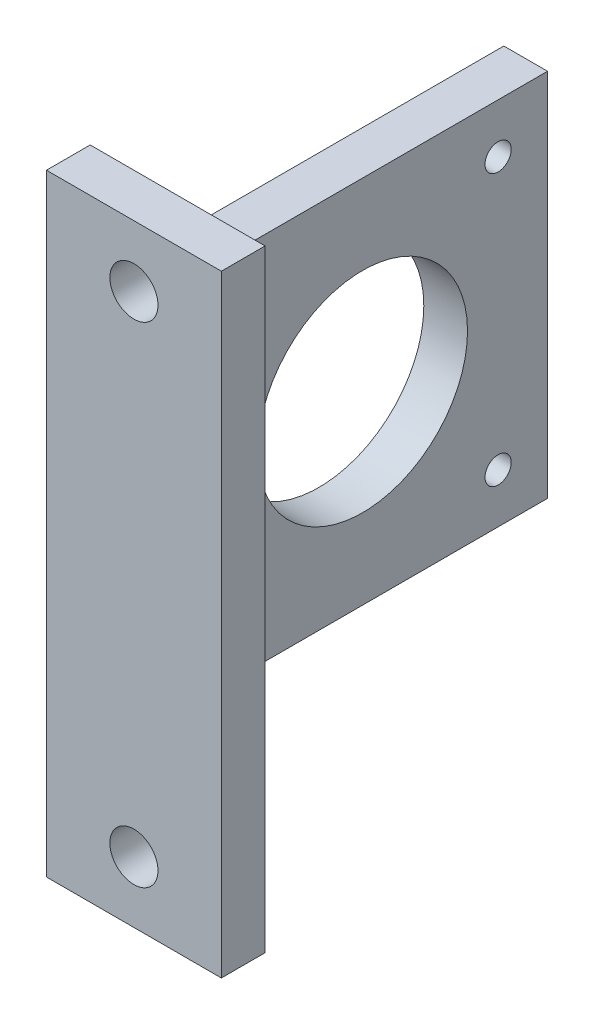
ISO-10303-21;
HEADER;
FILE_DESCRIPTION(('STEP AP214'),'2;1');
FILE_NAME('part.step','',(''),(''),'','','');
FILE_SCHEMA(('AUTOMOTIVE_DESIGN { 1 0 10303 214 1 1 1 1 }'));
ENDSEC;
DATA;
#1=APPLICATION_CONTEXT('core data for automotive mechanical design processes');
#2=APPLICATION_PROTOCOL_DEFINITION('international standard','automotive_design',2000,#1);
#3=PRODUCT_CONTEXT('',#1,'mechanical');
#4=PRODUCT('Part','Part','',(#3));
#5=PRODUCT_RELATED_PRODUCT_CATEGORY('part','',(#4));
#6=PRODUCT_DEFINITION_FORMATION('','',#4);
#7=PRODUCT_DEFINITION_CONTEXT('part definition',#1,'design');
#8=PRODUCT_DEFINITION('design','',#6,#7);
#9=PRODUCT_DEFINITION_SHAPE('','',#8);
#10=(LENGTH_UNIT() NAMED_UNIT(*) SI_UNIT(.MILLI.,.METRE.));
#11=(NAMED_UNIT(*) PLANE_ANGLE_UNIT() SI_UNIT($,.RADIAN.));
#12=(NAMED_UNIT(*) SI_UNIT($,.STERADIAN.) SOLID_ANGLE_UNIT());
#13=UNCERTAINTY_MEASURE_WITH_UNIT(LENGTH_MEASURE(1.E-05),#10,'distance_accuracy_value','');
#14=(GEOMETRIC_REPRESENTATION_CONTEXT(3) GLOBAL_UNCERTAINTY_ASSIGNED_CONTEXT((#13)) GLOBAL_UNIT_ASSIGNED_CONTEXT((#10,
#11,#12)) REPRESENTATION_CONTEXT('',''));
#15=CARTESIAN_POINT('',(0.,0.,0.));
#16=DIRECTION('',(0.,0.,1.));
#17=DIRECTION('',(1.,0.,0.));
#18=AXIS2_PLACEMENT_3D('',#15,#16,#17);
#19=CARTESIAN_POINT('',(5.,0.,0.));
#20=DIRECTION('',(1.,0.,0.));
#21=DIRECTION('',(0.,0.,-1.));
#22=AXIS2_PLACEMENT_3D('',#19,#20,#21);
#23=PLANE('',#22);
#24=CARTESIAN_POINT('',(5.,-15.5,15.5));
#25=DIRECTION('',(1.,0.,0.));
#26=DIRECTION('',(0.,0.,-1.));
#27=AXIS2_PLACEMENT_3D('',#24,#25,#26);
#28=CIRCLE('',#27,1.5);
#29=CARTESIAN_POINT('',(5.,-15.5,14.));
#30=VERTEX_POINT('',#29);
#31=EDGE_CURVE('E154',#30,#30,#28,.T.);
#32=ORIENTED_EDGE('',*,*,#31,.F.);
#33=EDGE_LOOP('',(#32));
#34=FACE_BOUND('',#33,.T.);
#35=CARTESIAN_POINT('',(5.,15.5,-15.5));
#36=DIRECTION('',(1.,0.,0.));
#37=DIRECTION('',(0.,0.,-1.));
#38=AXIS2_PLACEMENT_3D('',#35,#36,#37);
#39=CIRCLE('',#38,1.5);
#40=CARTESIAN_POINT('',(5.,15.5,-17.));
#41=VERTEX_POINT('',#40);
#42=EDGE_CURVE('E166',#41,#41,#39,.T.);
#43=ORIENTED_EDGE('',*,*,#42,.F.);
#44=EDGE_LOOP('',(#43));
#45=FACE_BOUND('',#44,.T.);
#46=DIRECTION('',(0.,1.,0.));
#47=VECTOR('',#46,1.);
#48=CARTESIAN_POINT('',(5.,21.15,-21.15));
#49=LINE('',#48,#47);
#50=CARTESIAN_POINT('',(5.,-21.15,-21.15));
#51=VERTEX_POINT('',#50);
#52=CARTESIAN_POINT('',(5.,21.15,-21.15));
#53=VERTEX_POINT('',#52);
#54=EDGE_CURVE('E178',#51,#53,#49,.T.);
#55=ORIENTED_EDGE('',*,*,#54,.T.);
#56=DIRECTION('',(0.,0.,1.));
#57=VECTOR('',#56,1.);
#58=CARTESIAN_POINT('',(5.,21.15,21.15));
#59=LINE('',#58,#57);
#60=CARTESIAN_POINT('',(5.,21.15,22.15));
#61=VERTEX_POINT('',#60);
#62=EDGE_CURVE('E181',#53,#61,#59,.T.);
#63=ORIENTED_EDGE('',*,*,#62,.T.);
#64=CARTESIAN_POINT('',(5.,25.15,22.15));
#65=DIRECTION('',(1.,0.,0.));
#66=DIRECTION('',(0.,0.,-1.));
#67=AXIS2_PLACEMENT_3D('',#64,#65,#66);
#68=CIRCLE('',#67,4.);
#69=CARTESIAN_POINT('',(5.,25.15,26.15));
#70=VERTEX_POINT('',#69);
#71=EDGE_CURVE('E11',#61,#70,#68,.F.);
#72=ORIENTED_EDGE('',*,*,#71,.T.);
#73=DIRECTION('',(0.,1.,0.));
#74=VECTOR('',#73,1.);
#75=CARTESIAN_POINT('',(5.,21.15,26.15));
#76=LINE('',#75,#74);
#77=CARTESIAN_POINT('',(5.,-25.15,26.15));
#78=VERTEX_POINT('',#77);
#79=EDGE_CURVE('E140',#78,#70,#76,.T.);
#80=ORIENTED_EDGE('',*,*,#79,.F.);
#81=CARTESIAN_POINT('',(5.,-25.15,22.15));
#82=DIRECTION('',(1.,0.,0.));
#83=DIRECTION('',(0.,0.,-1.));
#84=AXIS2_PLACEMENT_3D('',#81,#82,#83);
#85=CIRCLE('',#84,4.);
#86=CARTESIAN_POINT('',(5.,-21.15,22.15));
#87=VERTEX_POINT('',#86);
#88=EDGE_CURVE('E206',#78,#87,#85,.F.);
#89=ORIENTED_EDGE('',*,*,#88,.T.);
#90=DIRECTION('',(0.,0.,-1.));
#91=VECTOR('',#90,1.);
#92=CARTESIAN_POINT('',(5.,-21.15,21.15));
#93=LINE('',#92,#91);
#94=EDGE_CURVE('E184',#87,#51,#93,.T.);
#95=ORIENTED_EDGE('',*,*,#94,.T.);
#96=EDGE_LOOP('',(#55,#63,#72,#80,#89,#95));
#97=FACE_BOUND('',#96,.T.);
#98=CARTESIAN_POINT('',(5.,15.5,15.5));
#99=DIRECTION('',(1.,0.,0.));
#100=DIRECTION('',(0.,0.,-1.));
#101=AXIS2_PLACEMENT_3D('',#98,#99,#100);
#102=CIRCLE('',#101,1.5);
#103=CARTESIAN_POINT('',(5.,15.5,14.));
#104=VERTEX_POINT('',#103);
#105=EDGE_CURVE('E172',#104,#104,#102,.T.);
#106=ORIENTED_EDGE('',*,*,#105,.F.);
#107=EDGE_LOOP('',(#106));
#108=FACE_BOUND('',#107,.T.);
#109=CARTESIAN_POINT('',(5.,-15.5,-15.5));
#110=DIRECTION('',(1.,0.,0.));
#111=DIRECTION('',(0.,0.,-1.));
#112=AXIS2_PLACEMENT_3D('',#109,#110,#111);
#113=CIRCLE('',#112,1.5);
#114=CARTESIAN_POINT('',(5.,-15.5,-17.));
#115=VERTEX_POINT('',#114);
#116=EDGE_CURVE('E160',#115,#115,#113,.T.);
#117=ORIENTED_EDGE('',*,*,#116,.F.);
#118=EDGE_LOOP('',(#117));
#119=FACE_BOUND('',#118,.T.);
#120=CARTESIAN_POINT('',(5.,0.,0.));
#121=DIRECTION('',(1.,0.,0.));
#122=DIRECTION('',(0.,0.,-1.));
#123=AXIS2_PLACEMENT_3D('',#120,#121,#122);
#124=CIRCLE('',#123,12.);
#125=CARTESIAN_POINT('',(5.,0.,-12.));
#126=VERTEX_POINT('',#125);
#127=EDGE_CURVE('E148',#126,#126,#124,.T.);
#128=ORIENTED_EDGE('',*,*,#127,.F.);
#129=EDGE_LOOP('',(#128));
#130=FACE_BOUND('',#129,.T.);
#131=ADVANCED_FACE('F37',(#34,#45,#97,#108,#119,#130),#23,.T.);
#132=CARTESIAN_POINT('',(0.,0.,0.));
#133=DIRECTION('',(1.,0.,0.));
#134=DIRECTION('',(0.,0.,-1.));
#135=AXIS2_PLACEMENT_3D('',#132,#133,#134);
#136=PLANE('',#135);
#137=DIRECTION('',(0.,1.,0.));
#138=VECTOR('',#137,1.);
#139=CARTESIAN_POINT('',(0.,21.15,-21.15));
#140=LINE('',#139,#138);
#141=CARTESIAN_POINT('',(0.,-21.15,-21.15));
#142=VERTEX_POINT('',#141);
#143=CARTESIAN_POINT('',(0.,21.15,-21.15));
#144=VERTEX_POINT('',#143);
#145=EDGE_CURVE('E175',#142,#144,#140,.T.);
#146=ORIENTED_EDGE('',*,*,#145,.F.);
#147=DIRECTION('',(0.,0.,-1.));
#148=VECTOR('',#147,1.);
#149=CARTESIAN_POINT('',(0.,-21.15,21.15));
#150=LINE('',#149,#148);
#151=CARTESIAN_POINT('',(0.,-21.15,22.15));
#152=VERTEX_POINT('',#151);
#153=EDGE_CURVE('E182',#152,#142,#150,.T.);
#154=ORIENTED_EDGE('',*,*,#153,.F.);
#155=CARTESIAN_POINT('',(0.,-25.15,22.15));
#156=DIRECTION('',(1.,0.,0.));
#157=DIRECTION('',(0.,0.,-1.));
#158=AXIS2_PLACEMENT_3D('',#155,#156,#157);
#159=CIRCLE('',#158,4.);
#160=CARTESIAN_POINT('',(0.,-25.15,26.15));
#161=VERTEX_POINT('',#160);
#162=EDGE_CURVE('E208',#152,#161,#159,.T.);
#163=ORIENTED_EDGE('',*,*,#162,.T.);
#164=DIRECTION('',(0.,-1.,0.));
#165=VECTOR('',#164,1.);
#166=CARTESIAN_POINT('',(0.,35.,26.15));
#167=LINE('',#166,#165);
#168=CARTESIAN_POINT('',(0.,-35.,26.15));
#169=VERTEX_POINT('',#168);
#170=EDGE_CURVE('E212',#161,#169,#167,.T.);
#171=ORIENTED_EDGE('',*,*,#170,.T.);
#172=DIRECTION('',(0.,0.,-1.));
#173=VECTOR('',#172,1.);
#174=CARTESIAN_POINT('',(0.,-35.,31.15));
#175=LINE('',#174,#173);
#176=CARTESIAN_POINT('',(0.,-35.,31.15));
#177=VERTEX_POINT('',#176);
#178=EDGE_CURVE('E121',#177,#169,#175,.T.);
#179=ORIENTED_EDGE('',*,*,#178,.F.);
#180=DIRECTION('',(0.,-1.,0.));
#181=VECTOR('',#180,1.);
#182=CARTESIAN_POINT('',(0.,35.,31.15));
#183=LINE('',#182,#181);
#184=CARTESIAN_POINT('',(0.,35.,31.15));
#185=VERTEX_POINT('',#184);
#186=EDGE_CURVE('E112',#185,#177,#183,.T.);
#187=ORIENTED_EDGE('',*,*,#186,.F.);
#188=DIRECTION('',(0.,0.,-1.));
#189=VECTOR('',#188,1.);
#190=CARTESIAN_POINT('',(0.,35.,31.15));
#191=LINE('',#190,#189);
#192=CARTESIAN_POINT('',(0.,35.,26.15));
#193=VERTEX_POINT('',#192);
#194=EDGE_CURVE('E118',#185,#193,#191,.T.);
#195=ORIENTED_EDGE('',*,*,#194,.T.);
#196=CARTESIAN_POINT('',(0.,25.15,26.15));
#197=VERTEX_POINT('',#196);
#198=EDGE_CURVE('E221',#193,#197,#167,.T.);
#199=ORIENTED_EDGE('',*,*,#198,.T.);
#200=CARTESIAN_POINT('',(0.,25.15,22.15));
#201=DIRECTION('',(1.,0.,0.));
#202=DIRECTION('',(0.,0.,-1.));
#203=AXIS2_PLACEMENT_3D('',#200,#201,#202);
#204=CIRCLE('',#203,4.);
#205=CARTESIAN_POINT('',(0.,21.15,22.15));
#206=VERTEX_POINT('',#205);
#207=EDGE_CURVE('E45',#197,#206,#204,.T.);
#208=ORIENTED_EDGE('',*,*,#207,.T.);
#209=DIRECTION('',(0.,0.,1.));
#210=VECTOR('',#209,1.);
#211=CARTESIAN_POINT('',(0.,21.15,21.15));
#212=LINE('',#211,#210);
#213=EDGE_CURVE('E189',#144,#206,#212,.T.);
#214=ORIENTED_EDGE('',*,*,#213,.F.);
#215=EDGE_LOOP('',(#146,#154,#163,#171,#179,#187,#195,#199,#208,#214));
#216=FACE_BOUND('',#215,.T.);
#217=CARTESIAN_POINT('',(0.,15.5,15.5));
#218=DIRECTION('',(1.,0.,0.));
#219=DIRECTION('',(0.,0.,-1.));
#220=AXIS2_PLACEMENT_3D('',#217,#218,#219);
#221=CIRCLE('',#220,1.5);
#222=CARTESIAN_POINT('',(0.,15.5,14.));
#223=VERTEX_POINT('',#222);
#224=EDGE_CURVE('E169',#223,#223,#221,.T.);
#225=ORIENTED_EDGE('',*,*,#224,.T.);
#226=EDGE_LOOP('',(#225));
#227=FACE_BOUND('',#226,.T.);
#228=CARTESIAN_POINT('',(0.,15.5,-15.5));
#229=DIRECTION('',(1.,0.,0.));
#230=DIRECTION('',(0.,0.,-1.));
#231=AXIS2_PLACEMENT_3D('',#228,#229,#230);
#232=CIRCLE('',#231,1.5);
#233=CARTESIAN_POINT('',(0.,15.5,-17.));
#234=VERTEX_POINT('',#233);
#235=EDGE_CURVE('E163',#234,#234,#232,.T.);
#236=ORIENTED_EDGE('',*,*,#235,.T.);
#237=EDGE_LOOP('',(#236));
#238=FACE_BOUND('',#237,.T.);
#239=CARTESIAN_POINT('',(0.,-15.5,-15.5));
#240=DIRECTION('',(1.,0.,0.));
#241=DIRECTION('',(0.,0.,-1.));
#242=AXIS2_PLACEMENT_3D('',#239,#240,#241);
#243=CIRCLE('',#242,1.5);
#244=CARTESIAN_POINT('',(0.,-15.5,-17.));
#245=VERTEX_POINT('',#244);
#246=EDGE_CURVE('E157',#245,#245,#243,.T.);
#247=ORIENTED_EDGE('',*,*,#246,.T.);
#248=EDGE_LOOP('',(#247));
#249=FACE_BOUND('',#248,.T.);
#250=CARTESIAN_POINT('',(0.,-15.5,15.5));
#251=DIRECTION('',(1.,0.,0.));
#252=DIRECTION('',(0.,0.,-1.));
#253=AXIS2_PLACEMENT_3D('',#250,#251,#252);
#254=CIRCLE('',#253,1.5);
#255=CARTESIAN_POINT('',(0.,-15.5,14.));
#256=VERTEX_POINT('',#255);
#257=EDGE_CURVE('E151',#256,#256,#254,.T.);
#258=ORIENTED_EDGE('',*,*,#257,.T.);
#259=EDGE_LOOP('',(#258));
#260=FACE_BOUND('',#259,.T.);
#261=CARTESIAN_POINT('',(0.,0.,0.));
#262=DIRECTION('',(1.,0.,0.));
#263=DIRECTION('',(0.,0.,-1.));
#264=AXIS2_PLACEMENT_3D('',#261,#262,#263);
#265=CIRCLE('',#264,12.);
#266=CARTESIAN_POINT('',(0.,0.,-12.));
#267=VERTEX_POINT('',#266);
#268=EDGE_CURVE('E142',#267,#267,#265,.T.);
#269=ORIENTED_EDGE('',*,*,#268,.T.);
#270=EDGE_LOOP('',(#269));
#271=FACE_BOUND('',#270,.T.);
#272=ADVANCED_FACE('F115',(#216,#227,#238,#249,#260,#271),#136,.F.);
#273=CARTESIAN_POINT('',(5.,21.15,-21.15));
#274=DIRECTION('',(0.,0.,1.));
#275=DIRECTION('',(0.,-1.,0.));
#276=AXIS2_PLACEMENT_3D('',#273,#274,#275);
#277=PLANE('',#276);
#278=ORIENTED_EDGE('',*,*,#145,.T.);
#279=DIRECTION('',(-1.,0.,0.));
#280=VECTOR('',#279,1.);
#281=CARTESIAN_POINT('',(5.,21.15,-21.15));
#282=LINE('',#281,#280);
#283=EDGE_CURVE('E194',#53,#144,#282,.T.);
#284=ORIENTED_EDGE('',*,*,#283,.F.);
#285=ORIENTED_EDGE('',*,*,#54,.F.);
#286=DIRECTION('',(-1.,0.,0.));
#287=VECTOR('',#286,1.);
#288=CARTESIAN_POINT('',(5.,-21.15,-21.15));
#289=LINE('',#288,#287);
#290=EDGE_CURVE('E186',#51,#142,#289,.T.);
#291=ORIENTED_EDGE('',*,*,#290,.T.);
#292=EDGE_LOOP('',(#278,#284,#285,#291));
#293=FACE_BOUND('',#292,.T.);
#294=ADVANCED_FACE('F234',(#293),#277,.F.);
#295=CARTESIAN_POINT('',(5.,21.15,21.15));
#296=DIRECTION('',(0.,-1.,0.));
#297=DIRECTION('',(0.,0.,-1.));
#298=AXIS2_PLACEMENT_3D('',#295,#296,#297);
#299=PLANE('',#298);
#300=ORIENTED_EDGE('',*,*,#213,.T.);
#301=DIRECTION('',(-1.,0.,0.));
#302=VECTOR('',#301,1.);
#303=CARTESIAN_POINT('',(5.,21.15,22.15));
#304=LINE('',#303,#302);
#305=EDGE_CURVE('E52',#206,#61,#304,.F.);
#306=ORIENTED_EDGE('',*,*,#305,.T.);
#307=ORIENTED_EDGE('',*,*,#62,.F.);
#308=ORIENTED_EDGE('',*,*,#283,.T.);
#309=EDGE_LOOP('',(#300,#306,#307,#308));
#310=FACE_BOUND('',#309,.T.);
#311=ADVANCED_FACE('F287',(#310),#299,.F.);
#312=CARTESIAN_POINT('',(5.,-21.15,21.15));
#313=DIRECTION('',(0.,1.,0.));
#314=DIRECTION('',(0.,0.,1.));
#315=AXIS2_PLACEMENT_3D('',#312,#313,#314);
#316=PLANE('',#315);
#317=ORIENTED_EDGE('',*,*,#94,.F.);
#318=DIRECTION('',(1.,0.,0.));
#319=VECTOR('',#318,1.);
#320=CARTESIAN_POINT('',(0.,-21.15,22.15));
#321=LINE('',#320,#319);
#322=EDGE_CURVE('E203',#87,#152,#321,.F.);
#323=ORIENTED_EDGE('',*,*,#322,.T.);
#324=ORIENTED_EDGE('',*,*,#153,.T.);
#325=ORIENTED_EDGE('',*,*,#290,.F.);
#326=EDGE_LOOP('',(#317,#323,#324,#325));
#327=FACE_BOUND('',#326,.T.);
#328=ADVANCED_FACE('F230',(#327),#316,.F.);
#329=CARTESIAN_POINT('',(5.,15.5,15.5));
#330=DIRECTION('',(-1.,0.,0.));
#331=DIRECTION('',(0.,0.,1.));
#332=AXIS2_PLACEMENT_3D('',#329,#330,#331);
#333=CYLINDRICAL_SURFACE('',#332,1.5);
#334=ORIENTED_EDGE('',*,*,#105,.T.);
#335=EDGE_LOOP('',(#334));
#336=FACE_BOUND('',#335,.T.);
#337=ORIENTED_EDGE('',*,*,#224,.F.);
#338=EDGE_LOOP('',(#337));
#339=FACE_BOUND('',#338,.T.);
#340=ADVANCED_FACE('F282',(#336,#339),#333,.F.);
#341=CARTESIAN_POINT('',(5.,15.5,-15.5));
#342=DIRECTION('',(-1.,0.,0.));
#343=DIRECTION('',(0.,0.,1.));
#344=AXIS2_PLACEMENT_3D('',#341,#342,#343);
#345=CYLINDRICAL_SURFACE('',#344,1.5);
#346=ORIENTED_EDGE('',*,*,#42,.T.);
#347=EDGE_LOOP('',(#346));
#348=FACE_BOUND('',#347,.T.);
#349=ORIENTED_EDGE('',*,*,#235,.F.);
#350=EDGE_LOOP('',(#349));
#351=FACE_BOUND('',#350,.T.);
#352=ADVANCED_FACE('F333',(#348,#351),#345,.F.);
#353=CARTESIAN_POINT('',(5.,-15.5,-15.5));
#354=DIRECTION('',(-1.,0.,0.));
#355=DIRECTION('',(0.,0.,1.));
#356=AXIS2_PLACEMENT_3D('',#353,#354,#355);
#357=CYLINDRICAL_SURFACE('',#356,1.5);
#358=ORIENTED_EDGE('',*,*,#116,.T.);
#359=EDGE_LOOP('',(#358));
#360=FACE_BOUND('',#359,.T.);
#361=ORIENTED_EDGE('',*,*,#246,.F.);
#362=EDGE_LOOP('',(#361));
#363=FACE_BOUND('',#362,.T.);
#364=ADVANCED_FACE('F327',(#360,#363),#357,.F.);
#365=CARTESIAN_POINT('',(5.,-15.5,15.5));
#366=DIRECTION('',(-1.,0.,0.));
#367=DIRECTION('',(0.,0.,1.));
#368=AXIS2_PLACEMENT_3D('',#365,#366,#367);
#369=CYLINDRICAL_SURFACE('',#368,1.5);
#370=ORIENTED_EDGE('',*,*,#31,.T.);
#371=EDGE_LOOP('',(#370));
#372=FACE_BOUND('',#371,.T.);
#373=ORIENTED_EDGE('',*,*,#257,.F.);
#374=EDGE_LOOP('',(#373));
#375=FACE_BOUND('',#374,.T.);
#376=ADVANCED_FACE('F315',(#372,#375),#369,.F.);
#377=CARTESIAN_POINT('',(5.,0.,0.));
#378=DIRECTION('',(-1.,0.,0.));
#379=DIRECTION('',(0.,0.,1.));
#380=AXIS2_PLACEMENT_3D('',#377,#378,#379);
#381=CYLINDRICAL_SURFACE('',#380,12.);
#382=ORIENTED_EDGE('',*,*,#127,.T.);
#383=EDGE_LOOP('',(#382));
#384=FACE_BOUND('',#383,.T.);
#385=ORIENTED_EDGE('',*,*,#268,.F.);
#386=EDGE_LOOP('',(#385));
#387=FACE_BOUND('',#386,.T.);
#388=ADVANCED_FACE('F310',(#384,#387),#381,.F.);
#389=CARTESIAN_POINT('',(0.,0.,26.15));
#390=DIRECTION('',(0.,0.,1.));
#391=DIRECTION('',(1.,0.,0.));
#392=AXIS2_PLACEMENT_3D('',#389,#390,#391);
#393=PLANE('',#392);
#394=CARTESIAN_POINT('',(10.,28.,26.15));
#395=DIRECTION('',(0.,0.,1.));
#396=DIRECTION('',(1.,0.,0.));
#397=AXIS2_PLACEMENT_3D('',#394,#395,#396);
#398=CIRCLE('',#397,2.75);
#399=CARTESIAN_POINT('',(12.75,28.,26.15));
#400=VERTEX_POINT('',#399);
#401=EDGE_CURVE('E251',#400,#400,#398,.T.);
#402=ORIENTED_EDGE('',*,*,#401,.T.);
#403=EDGE_LOOP('',(#402));
#404=FACE_BOUND('',#403,.T.);
#405=CARTESIAN_POINT('',(10.,-28.,26.15));
#406=DIRECTION('',(0.,0.,1.));
#407=DIRECTION('',(1.,0.,0.));
#408=AXIS2_PLACEMENT_3D('',#405,#406,#407);
#409=CIRCLE('',#408,2.75);
#410=CARTESIAN_POINT('',(12.75,-28.,26.15));
#411=VERTEX_POINT('',#410);
#412=EDGE_CURVE('E259',#411,#411,#409,.T.);
#413=ORIENTED_EDGE('',*,*,#412,.T.);
#414=EDGE_LOOP('',(#413));
#415=FACE_BOUND('',#414,.T.);
#416=ORIENTED_EDGE('',*,*,#170,.F.);
#417=DIRECTION('',(1.,0.,0.));
#418=VECTOR('',#417,1.);
#419=CARTESIAN_POINT('',(5.,-25.15,26.15));
#420=LINE('',#419,#418);
#421=EDGE_CURVE('E200',#161,#78,#420,.T.);
#422=ORIENTED_EDGE('',*,*,#421,.T.);
#423=ORIENTED_EDGE('',*,*,#79,.T.);
#424=DIRECTION('',(-1.,0.,0.));
#425=VECTOR('',#424,1.);
#426=CARTESIAN_POINT('',(0.,25.15,26.15));
#427=LINE('',#426,#425);
#428=EDGE_CURVE('E197',#70,#197,#427,.T.);
#429=ORIENTED_EDGE('',*,*,#428,.T.);
#430=ORIENTED_EDGE('',*,*,#198,.F.);
#431=DIRECTION('',(-1.,0.,0.));
#432=VECTOR('',#431,1.);
#433=CARTESIAN_POINT('',(20.,35.,26.15));
#434=LINE('',#433,#432);
#435=CARTESIAN_POINT('',(20.,35.,26.15));
#436=VERTEX_POINT('',#435);
#437=EDGE_CURVE('E139',#436,#193,#434,.T.);
#438=ORIENTED_EDGE('',*,*,#437,.F.);
#439=DIRECTION('',(0.,1.,0.));
#440=VECTOR('',#439,1.);
#441=CARTESIAN_POINT('',(20.,-35.,26.15));
#442=LINE('',#441,#440);
#443=CARTESIAN_POINT('',(20.,-35.,26.15));
#444=VERTEX_POINT('',#443);
#445=EDGE_CURVE('E135',#444,#436,#442,.T.);
#446=ORIENTED_EDGE('',*,*,#445,.F.);
#447=DIRECTION('',(1.,0.,0.));
#448=VECTOR('',#447,1.);
#449=CARTESIAN_POINT('',(0.,-35.,26.15));
#450=LINE('',#449,#448);
#451=EDGE_CURVE('E220',#169,#444,#450,.T.);
#452=ORIENTED_EDGE('',*,*,#451,.F.);
#453=EDGE_LOOP('',(#416,#422,#423,#429,#430,#438,#446,#452));
#454=FACE_BOUND('',#453,.T.);
#455=ADVANCED_FACE('F218',(#404,#415,#454),#393,.F.);
#456=CARTESIAN_POINT('',(0.,0.,31.15));
#457=DIRECTION('',(0.,0.,1.));
#458=DIRECTION('',(1.,0.,0.));
#459=AXIS2_PLACEMENT_3D('',#456,#457,#458);
#460=PLANE('',#459);
#461=CARTESIAN_POINT('',(10.,28.,31.15));
#462=DIRECTION('',(0.,0.,1.));
#463=DIRECTION('',(1.,0.,0.));
#464=AXIS2_PLACEMENT_3D('',#461,#462,#463);
#465=CIRCLE('',#464,2.75);
#466=CARTESIAN_POINT('',(12.75,28.,31.15));
#467=VERTEX_POINT('',#466);
#468=EDGE_CURVE('E249',#467,#467,#465,.T.);
#469=ORIENTED_EDGE('',*,*,#468,.F.);
#470=EDGE_LOOP('',(#469));
#471=FACE_BOUND('',#470,.T.);
#472=DIRECTION('',(-1.,0.,0.));
#473=VECTOR('',#472,1.);
#474=CARTESIAN_POINT('',(20.,35.,31.15));
#475=LINE('',#474,#473);
#476=CARTESIAN_POINT('',(20.,35.,31.15));
#477=VERTEX_POINT('',#476);
#478=EDGE_CURVE('E125',#477,#185,#475,.T.);
#479=ORIENTED_EDGE('',*,*,#478,.T.);
#480=ORIENTED_EDGE('',*,*,#186,.T.);
#481=DIRECTION('',(1.,0.,0.));
#482=VECTOR('',#481,1.);
#483=CARTESIAN_POINT('',(0.,-35.,31.15));
#484=LINE('',#483,#482);
#485=CARTESIAN_POINT('',(20.,-35.,31.15));
#486=VERTEX_POINT('',#485);
#487=EDGE_CURVE('E124',#177,#486,#484,.T.);
#488=ORIENTED_EDGE('',*,*,#487,.T.);
#489=DIRECTION('',(0.,1.,0.));
#490=VECTOR('',#489,1.);
#491=CARTESIAN_POINT('',(20.,-35.,31.15));
#492=LINE('',#491,#490);
#493=EDGE_CURVE('E131',#486,#477,#492,.T.);
#494=ORIENTED_EDGE('',*,*,#493,.T.);
#495=EDGE_LOOP('',(#479,#480,#488,#494));
#496=FACE_BOUND('',#495,.T.);
#497=CARTESIAN_POINT('',(10.,-28.,31.15));
#498=DIRECTION('',(0.,0.,1.));
#499=DIRECTION('',(1.,0.,0.));
#500=AXIS2_PLACEMENT_3D('',#497,#498,#499);
#501=CIRCLE('',#500,2.75);
#502=CARTESIAN_POINT('',(12.75,-28.,31.15));
#503=VERTEX_POINT('',#502);
#504=EDGE_CURVE('E256',#503,#503,#501,.T.);
#505=ORIENTED_EDGE('',*,*,#504,.F.);
#506=EDGE_LOOP('',(#505));
#507=FACE_BOUND('',#506,.T.);
#508=ADVANCED_FACE('F128',(#471,#496,#507),#460,.T.);
#509=CARTESIAN_POINT('',(20.,35.,31.15));
#510=DIRECTION('',(0.,-1.,0.));
#511=DIRECTION('',(0.,0.,-1.));
#512=AXIS2_PLACEMENT_3D('',#509,#510,#511);
#513=PLANE('',#512);
#514=ORIENTED_EDGE('',*,*,#437,.T.);
#515=ORIENTED_EDGE('',*,*,#194,.F.);
#516=ORIENTED_EDGE('',*,*,#478,.F.);
#517=DIRECTION('',(0.,0.,-1.));
#518=VECTOR('',#517,1.);
#519=CARTESIAN_POINT('',(20.,35.,31.15));
#520=LINE('',#519,#518);
#521=EDGE_CURVE('E243',#477,#436,#520,.T.);
#522=ORIENTED_EDGE('',*,*,#521,.T.);
#523=EDGE_LOOP('',(#514,#515,#516,#522));
#524=FACE_BOUND('',#523,.T.);
#525=ADVANCED_FACE('F137',(#524),#513,.F.);
#526=CARTESIAN_POINT('',(0.,-35.,31.15));
#527=DIRECTION('',(0.,1.,0.));
#528=DIRECTION('',(0.,0.,1.));
#529=AXIS2_PLACEMENT_3D('',#526,#527,#528);
#530=PLANE('',#529);
#531=ORIENTED_EDGE('',*,*,#451,.T.);
#532=DIRECTION('',(0.,0.,-1.));
#533=VECTOR('',#532,1.);
#534=CARTESIAN_POINT('',(20.,-35.,31.15));
#535=LINE('',#534,#533);
#536=EDGE_CURVE('E144',#486,#444,#535,.T.);
#537=ORIENTED_EDGE('',*,*,#536,.F.);
#538=ORIENTED_EDGE('',*,*,#487,.F.);
#539=ORIENTED_EDGE('',*,*,#178,.T.);
#540=EDGE_LOOP('',(#531,#537,#538,#539));
#541=FACE_BOUND('',#540,.T.);
#542=ADVANCED_FACE('F262',(#541),#530,.F.);
#543=CARTESIAN_POINT('',(20.,-35.,31.15));
#544=DIRECTION('',(-1.,0.,0.));
#545=DIRECTION('',(0.,0.,1.));
#546=AXIS2_PLACEMENT_3D('',#543,#544,#545);
#547=PLANE('',#546);
#548=ORIENTED_EDGE('',*,*,#445,.T.);
#549=ORIENTED_EDGE('',*,*,#521,.F.);
#550=ORIENTED_EDGE('',*,*,#493,.F.);
#551=ORIENTED_EDGE('',*,*,#536,.T.);
#552=EDGE_LOOP('',(#548,#549,#550,#551));
#553=FACE_BOUND('',#552,.T.);
#554=ADVANCED_FACE('F247',(#553),#547,.F.);
#555=CARTESIAN_POINT('',(10.,28.,31.15));
#556=DIRECTION('',(0.,0.,-1.));
#557=DIRECTION('',(-1.,0.,0.));
#558=AXIS2_PLACEMENT_3D('',#555,#556,#557);
#559=CYLINDRICAL_SURFACE('',#558,2.75);
#560=ORIENTED_EDGE('',*,*,#468,.T.);
#561=EDGE_LOOP('',(#560));
#562=FACE_BOUND('',#561,.T.);
#563=ORIENTED_EDGE('',*,*,#401,.F.);
#564=EDGE_LOOP('',(#563));
#565=FACE_BOUND('',#564,.T.);
#566=ADVANCED_FACE('F269',(#562,#565),#559,.F.);
#567=CARTESIAN_POINT('',(10.,-28.,31.15));
#568=DIRECTION('',(0.,0.,-1.));
#569=DIRECTION('',(-1.,0.,0.));
#570=AXIS2_PLACEMENT_3D('',#567,#568,#569);
#571=CYLINDRICAL_SURFACE('',#570,2.75);
#572=ORIENTED_EDGE('',*,*,#504,.T.);
#573=EDGE_LOOP('',(#572));
#574=FACE_BOUND('',#573,.T.);
#575=ORIENTED_EDGE('',*,*,#412,.F.);
#576=EDGE_LOOP('',(#575));
#577=FACE_BOUND('',#576,.T.);
#578=ADVANCED_FACE('F292',(#574,#577),#571,.F.);
#579=CARTESIAN_POINT('',(0.,-25.15,22.15));
#580=DIRECTION('',(-1.,0.,0.));
#581=DIRECTION('',(0.,0.,1.));
#582=AXIS2_PLACEMENT_3D('',#579,#580,#581);
#583=CYLINDRICAL_SURFACE('',#582,4.);
#584=ORIENTED_EDGE('',*,*,#162,.F.);
#585=ORIENTED_EDGE('',*,*,#322,.F.);
#586=ORIENTED_EDGE('',*,*,#88,.F.);
#587=ORIENTED_EDGE('',*,*,#421,.F.);
#588=EDGE_LOOP('',(#584,#585,#586,#587));
#589=FACE_BOUND('',#588,.T.);
#590=ADVANCED_FACE('F224',(#589),#583,.F.);
#591=CARTESIAN_POINT('',(0.,25.15,22.15));
#592=DIRECTION('',(1.,0.,0.));
#593=DIRECTION('',(0.,0.,-1.));
#594=AXIS2_PLACEMENT_3D('',#591,#592,#593);
#595=CYLINDRICAL_SURFACE('',#594,4.);
#596=ORIENTED_EDGE('',*,*,#71,.F.);
#597=ORIENTED_EDGE('',*,*,#305,.F.);
#598=ORIENTED_EDGE('',*,*,#207,.F.);
#599=ORIENTED_EDGE('',*,*,#428,.F.);
#600=EDGE_LOOP('',(#596,#597,#598,#599));
#601=FACE_BOUND('',#600,.T.);
#602=ADVANCED_FACE('F39',(#601),#595,.F.);
#603=CLOSED_SHELL('',(#131,#272,#294,#311,#328,#340,#352,#364,#376,#388,#455,#508,#525,#542,
#554,#566,#578,#590,#602));
#604=MANIFOLD_SOLID_BREP('B2',#603);
#605=ADVANCED_BREP_SHAPE_REPRESENTATION('',(#18,#604),#14);
#606=SHAPE_DEFINITION_REPRESENTATION(#9,#605);
ENDSEC;
END-ISO-10303-21;
